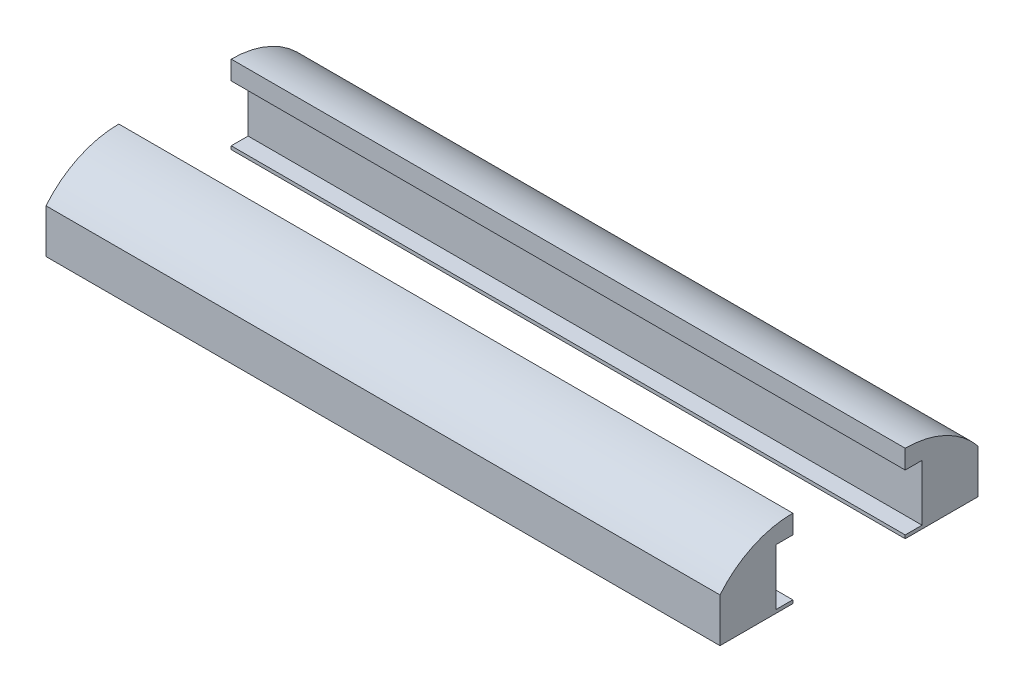
ISO-10303-21;
HEADER;
FILE_DESCRIPTION(('STEP AP214'),'2;1');
FILE_NAME('part.step','',(''),(''),'','','');
FILE_SCHEMA(('AUTOMOTIVE_DESIGN { 1 0 10303 214 1 1 1 1 }'));
ENDSEC;
DATA;
#1=APPLICATION_CONTEXT('core data for automotive mechanical design processes');
#2=APPLICATION_PROTOCOL_DEFINITION('international standard','automotive_design',2000,#1);
#3=PRODUCT_CONTEXT('',#1,'mechanical');
#4=PRODUCT('Part','Part','',(#3));
#5=PRODUCT_RELATED_PRODUCT_CATEGORY('part','',(#4));
#6=PRODUCT_DEFINITION_FORMATION('','',#4);
#7=PRODUCT_DEFINITION_CONTEXT('part definition',#1,'design');
#8=PRODUCT_DEFINITION('design','',#6,#7);
#9=PRODUCT_DEFINITION_SHAPE('','',#8);
#10=(LENGTH_UNIT() NAMED_UNIT(*) SI_UNIT(.MILLI.,.METRE.));
#11=(NAMED_UNIT(*) PLANE_ANGLE_UNIT() SI_UNIT($,.RADIAN.));
#12=(NAMED_UNIT(*) SI_UNIT($,.STERADIAN.) SOLID_ANGLE_UNIT());
#13=UNCERTAINTY_MEASURE_WITH_UNIT(LENGTH_MEASURE(1.E-05),#10,'distance_accuracy_value','');
#14=(GEOMETRIC_REPRESENTATION_CONTEXT(3) GLOBAL_UNCERTAINTY_ASSIGNED_CONTEXT((#13)) GLOBAL_UNIT_ASSIGNED_CONTEXT((#10,
#11,#12)) REPRESENTATION_CONTEXT('',''));
#15=CARTESIAN_POINT('',(0.,0.,0.));
#16=DIRECTION('',(0.,0.,1.));
#17=DIRECTION('',(1.,0.,0.));
#18=AXIS2_PLACEMENT_3D('',#15,#16,#17);
#19=CARTESIAN_POINT('',(120.,10.5947602395424,13.0083445093653));
#20=DIRECTION('',(0.,1.,0.));
#21=DIRECTION('',(0.,0.,1.));
#22=AXIS2_PLACEMENT_3D('',#19,#20,#21);
#23=PLANE('',#22);
#24=DIRECTION('',(0.,0.,-1.));
#25=VECTOR('',#24,1.);
#26=CARTESIAN_POINT('',(0.,10.5947602395424,13.0083445093653));
#27=LINE('',#26,#25);
#28=CARTESIAN_POINT('',(0.,10.5947602395424,13.0083445093653));
#29=VERTEX_POINT('',#28);
#30=CARTESIAN_POINT('',(0.,10.5947602395424,10.0083445093653));
#31=VERTEX_POINT('',#30);
#32=EDGE_CURVE('E12',#29,#31,#27,.T.);
#33=ORIENTED_EDGE('',*,*,#32,.T.);
#34=DIRECTION('',(-1.,0.,0.));
#35=VECTOR('',#34,1.);
#36=CARTESIAN_POINT('',(120.,10.5947602395424,10.0083445093653));
#37=LINE('',#36,#35);
#38=CARTESIAN_POINT('',(120.,10.5947602395424,10.0083445093653));
#39=VERTEX_POINT('',#38);
#40=EDGE_CURVE('E185',#39,#31,#37,.T.);
#41=ORIENTED_EDGE('',*,*,#40,.F.);
#42=DIRECTION('',(0.,0.,-1.));
#43=VECTOR('',#42,1.);
#44=CARTESIAN_POINT('',(120.,10.5947602395424,13.0083445093653));
#45=LINE('',#44,#43);
#46=CARTESIAN_POINT('',(120.,10.5947602395424,13.0083445093653));
#47=VERTEX_POINT('',#46);
#48=EDGE_CURVE('E53',#47,#39,#45,.T.);
#49=ORIENTED_EDGE('',*,*,#48,.F.);
#50=DIRECTION('',(-1.,0.,0.));
#51=VECTOR('',#50,1.);
#52=CARTESIAN_POINT('',(120.,10.5947602395424,13.0083445093653));
#53=LINE('',#52,#51);
#54=EDGE_CURVE('E153',#47,#29,#53,.T.);
#55=ORIENTED_EDGE('',*,*,#54,.T.);
#56=EDGE_LOOP('',(#33,#41,#49,#55));
#57=FACE_BOUND('',#56,.T.);
#58=ADVANCED_FACE('F49',(#57),#23,.F.);
#59=CARTESIAN_POINT('',(120.,10.5947602395424,10.0083445093653));
#60=DIRECTION('',(0.,0.,1.));
#61=DIRECTION('',(1.,0.,0.));
#62=AXIS2_PLACEMENT_3D('',#59,#60,#61);
#63=PLANE('',#62);
#64=DIRECTION('',(0.,1.,0.));
#65=VECTOR('',#64,1.);
#66=CARTESIAN_POINT('',(0.,10.5947602395424,10.0083445093653));
#67=LINE('',#66,#65);
#68=CARTESIAN_POINT('',(0.,13.96,10.0083445093653));
#69=VERTEX_POINT('',#68);
#70=EDGE_CURVE('E59',#31,#69,#67,.T.);
#71=ORIENTED_EDGE('',*,*,#70,.T.);
#72=DIRECTION('',(-1.,0.,0.));
#73=VECTOR('',#72,1.);
#74=CARTESIAN_POINT('',(120.,13.96,10.0083445093653));
#75=LINE('',#74,#73);
#76=CARTESIAN_POINT('',(120.,13.96,10.0083445093653));
#77=VERTEX_POINT('',#76);
#78=EDGE_CURVE('E129',#77,#69,#75,.T.);
#79=ORIENTED_EDGE('',*,*,#78,.F.);
#80=DIRECTION('',(0.,1.,0.));
#81=VECTOR('',#80,1.);
#82=CARTESIAN_POINT('',(120.,10.5947602395424,10.0083445093653));
#83=LINE('',#82,#81);
#84=EDGE_CURVE('E95',#39,#77,#83,.T.);
#85=ORIENTED_EDGE('',*,*,#84,.F.);
#86=ORIENTED_EDGE('',*,*,#40,.T.);
#87=EDGE_LOOP('',(#71,#79,#85,#86));
#88=FACE_BOUND('',#87,.T.);
#89=ADVANCED_FACE('F191',(#88),#63,.F.);
#90=CARTESIAN_POINT('',(120.,-2.8049673735726,10.0083445093653));
#91=DIRECTION('',(-1.,0.,0.));
#92=DIRECTION('',(0.,0.,1.));
#93=AXIS2_PLACEMENT_3D('',#90,#91,#92);
#94=CYLINDRICAL_SURFACE('',#93,16.7649673735726);
#95=CARTESIAN_POINT('',(0.,-2.8049673735726,10.0083445093653));
#96=DIRECTION('',(1.,0.,0.));
#97=DIRECTION('',(0.,0.,-1.));
#98=AXIS2_PLACEMENT_3D('',#95,#96,#97);
#99=CIRCLE('',#98,16.7649673735726);
#100=CARTESIAN_POINT('',(0.,7.83,22.9683445093653));
#101=VERTEX_POINT('',#100);
#102=EDGE_CURVE('E123',#69,#101,#99,.T.);
#103=ORIENTED_EDGE('',*,*,#102,.T.);
#104=DIRECTION('',(-1.,0.,0.));
#105=VECTOR('',#104,1.);
#106=CARTESIAN_POINT('',(120.,7.83,22.9683445093653));
#107=LINE('',#106,#105);
#108=CARTESIAN_POINT('',(120.,7.83,22.9683445093653));
#109=VERTEX_POINT('',#108);
#110=EDGE_CURVE('E127',#109,#101,#107,.T.);
#111=ORIENTED_EDGE('',*,*,#110,.F.);
#112=CARTESIAN_POINT('',(120.,-2.8049673735726,10.0083445093653));
#113=DIRECTION('',(1.,0.,0.));
#114=DIRECTION('',(0.,0.,-1.));
#115=AXIS2_PLACEMENT_3D('',#112,#113,#114);
#116=CIRCLE('',#115,16.7649673735726);
#117=EDGE_CURVE('E160',#77,#109,#116,.T.);
#118=ORIENTED_EDGE('',*,*,#117,.F.);
#119=ORIENTED_EDGE('',*,*,#78,.T.);
#120=EDGE_LOOP('',(#103,#111,#118,#119));
#121=FACE_BOUND('',#120,.T.);
#122=ADVANCED_FACE('F125',(#121),#94,.T.);
#123=CARTESIAN_POINT('',(120.,0.,22.9683445093653));
#124=DIRECTION('',(0.,0.,-1.));
#125=DIRECTION('',(0.,1.,0.));
#126=AXIS2_PLACEMENT_3D('',#123,#124,#125);
#127=PLANE('',#126);
#128=DIRECTION('',(0.,-1.,0.));
#129=VECTOR('',#128,1.);
#130=CARTESIAN_POINT('',(0.,0.,22.9683445093653));
#131=LINE('',#130,#129);
#132=CARTESIAN_POINT('',(0.,0.,22.9683445093653));
#133=VERTEX_POINT('',#132);
#134=EDGE_CURVE('E131',#101,#133,#131,.T.);
#135=ORIENTED_EDGE('',*,*,#134,.T.);
#136=DIRECTION('',(-1.,0.,0.));
#137=VECTOR('',#136,1.);
#138=CARTESIAN_POINT('',(120.,0.,22.9683445093653));
#139=LINE('',#138,#137);
#140=CARTESIAN_POINT('',(120.,0.,22.9683445093653));
#141=VERTEX_POINT('',#140);
#142=EDGE_CURVE('E138',#141,#133,#139,.T.);
#143=ORIENTED_EDGE('',*,*,#142,.F.);
#144=DIRECTION('',(0.,-1.,0.));
#145=VECTOR('',#144,1.);
#146=CARTESIAN_POINT('',(120.,0.,22.9683445093653));
#147=LINE('',#146,#145);
#148=EDGE_CURVE('E137',#109,#141,#147,.T.);
#149=ORIENTED_EDGE('',*,*,#148,.F.);
#150=ORIENTED_EDGE('',*,*,#110,.T.);
#151=EDGE_LOOP('',(#135,#143,#149,#150));
#152=FACE_BOUND('',#151,.T.);
#153=ADVANCED_FACE('F134',(#152),#127,.F.);
#154=CARTESIAN_POINT('',(120.,0.,10.0083445093653));
#155=DIRECTION('',(0.,1.,0.));
#156=DIRECTION('',(0.,0.,1.));
#157=AXIS2_PLACEMENT_3D('',#154,#155,#156);
#158=PLANE('',#157);
#159=DIRECTION('',(0.,0.,-1.));
#160=VECTOR('',#159,1.);
#161=CARTESIAN_POINT('',(0.,0.,10.0083445093653));
#162=LINE('',#161,#160);
#163=CARTESIAN_POINT('',(0.,0.,10.0083445093653));
#164=VERTEX_POINT('',#163);
#165=EDGE_CURVE('E143',#133,#164,#162,.T.);
#166=ORIENTED_EDGE('',*,*,#165,.T.);
#167=DIRECTION('',(-1.,0.,0.));
#168=VECTOR('',#167,1.);
#169=CARTESIAN_POINT('',(120.,0.,10.0083445093653));
#170=LINE('',#169,#168);
#171=CARTESIAN_POINT('',(120.,0.,10.0083445093653));
#172=VERTEX_POINT('',#171);
#173=EDGE_CURVE('E177',#172,#164,#170,.T.);
#174=ORIENTED_EDGE('',*,*,#173,.F.);
#175=DIRECTION('',(0.,0.,-1.));
#176=VECTOR('',#175,1.);
#177=CARTESIAN_POINT('',(120.,0.,10.0083445093653));
#178=LINE('',#177,#176);
#179=EDGE_CURVE('E157',#141,#172,#178,.T.);
#180=ORIENTED_EDGE('',*,*,#179,.F.);
#181=ORIENTED_EDGE('',*,*,#142,.T.);
#182=EDGE_LOOP('',(#166,#174,#180,#181));
#183=FACE_BOUND('',#182,.T.);
#184=ADVANCED_FACE('F194',(#183),#158,.F.);
#185=CARTESIAN_POINT('',(120.,0.,10.0083445093653));
#186=DIRECTION('',(0.,0.,1.));
#187=DIRECTION('',(1.,0.,0.));
#188=AXIS2_PLACEMENT_3D('',#185,#186,#187);
#189=PLANE('',#188);
#190=DIRECTION('',(0.,1.,0.));
#191=VECTOR('',#190,1.);
#192=CARTESIAN_POINT('',(0.,0.,10.0083445093653));
#193=LINE('',#192,#191);
#194=CARTESIAN_POINT('',(0.,0.594760239542357,10.0083445093653));
#195=VERTEX_POINT('',#194);
#196=EDGE_CURVE('E145',#164,#195,#193,.T.);
#197=ORIENTED_EDGE('',*,*,#196,.T.);
#198=DIRECTION('',(-1.,0.,0.));
#199=VECTOR('',#198,1.);
#200=CARTESIAN_POINT('',(120.,0.594760239542357,10.0083445093653));
#201=LINE('',#200,#199);
#202=CARTESIAN_POINT('',(120.,0.594760239542357,10.0083445093653));
#203=VERTEX_POINT('',#202);
#204=EDGE_CURVE('E174',#203,#195,#201,.T.);
#205=ORIENTED_EDGE('',*,*,#204,.F.);
#206=DIRECTION('',(0.,1.,0.));
#207=VECTOR('',#206,1.);
#208=CARTESIAN_POINT('',(120.,0.,10.0083445093653));
#209=LINE('',#208,#207);
#210=EDGE_CURVE('E155',#172,#203,#209,.T.);
#211=ORIENTED_EDGE('',*,*,#210,.F.);
#212=ORIENTED_EDGE('',*,*,#173,.T.);
#213=EDGE_LOOP('',(#197,#205,#211,#212));
#214=FACE_BOUND('',#213,.T.);
#215=ADVANCED_FACE('F172',(#214),#189,.F.);
#216=CARTESIAN_POINT('',(120.,0.594760239542357,10.0083445093653));
#217=DIRECTION('',(0.,-1.,0.));
#218=DIRECTION('',(0.,0.,-1.));
#219=AXIS2_PLACEMENT_3D('',#216,#217,#218);
#220=PLANE('',#219);
#221=DIRECTION('',(0.,0.,1.));
#222=VECTOR('',#221,1.);
#223=CARTESIAN_POINT('',(0.,0.594760239542357,10.0083445093653));
#224=LINE('',#223,#222);
#225=CARTESIAN_POINT('',(0.,0.594760239542357,13.0083445093653));
#226=VERTEX_POINT('',#225);
#227=EDGE_CURVE('E163',#195,#226,#224,.T.);
#228=ORIENTED_EDGE('',*,*,#227,.T.);
#229=DIRECTION('',(-1.,0.,0.));
#230=VECTOR('',#229,1.);
#231=CARTESIAN_POINT('',(120.,0.594760239542357,13.0083445093653));
#232=LINE('',#231,#230);
#233=CARTESIAN_POINT('',(120.,0.594760239542357,13.0083445093653));
#234=VERTEX_POINT('',#233);
#235=EDGE_CURVE('E182',#234,#226,#232,.T.);
#236=ORIENTED_EDGE('',*,*,#235,.F.);
#237=DIRECTION('',(0.,0.,1.));
#238=VECTOR('',#237,1.);
#239=CARTESIAN_POINT('',(120.,0.594760239542357,10.0083445093653));
#240=LINE('',#239,#238);
#241=EDGE_CURVE('E152',#203,#234,#240,.T.);
#242=ORIENTED_EDGE('',*,*,#241,.F.);
#243=ORIENTED_EDGE('',*,*,#204,.T.);
#244=EDGE_LOOP('',(#228,#236,#242,#243));
#245=FACE_BOUND('',#244,.T.);
#246=ADVANCED_FACE('F180',(#245),#220,.F.);
#247=CARTESIAN_POINT('',(120.,0.594760239542357,13.0083445093653));
#248=DIRECTION('',(0.,0.,1.));
#249=DIRECTION('',(1.,0.,0.));
#250=AXIS2_PLACEMENT_3D('',#247,#248,#249);
#251=PLANE('',#250);
#252=DIRECTION('',(0.,1.,0.));
#253=VECTOR('',#252,1.);
#254=CARTESIAN_POINT('',(0.,0.594760239542357,13.0083445093653));
#255=LINE('',#254,#253);
#256=EDGE_CURVE('E106',#226,#29,#255,.T.);
#257=ORIENTED_EDGE('',*,*,#256,.T.);
#258=ORIENTED_EDGE('',*,*,#54,.F.);
#259=DIRECTION('',(0.,1.,0.));
#260=VECTOR('',#259,1.);
#261=CARTESIAN_POINT('',(120.,0.594760239542357,13.0083445093653));
#262=LINE('',#261,#260);
#263=EDGE_CURVE('E150',#234,#47,#262,.T.);
#264=ORIENTED_EDGE('',*,*,#263,.F.);
#265=ORIENTED_EDGE('',*,*,#235,.T.);
#266=EDGE_LOOP('',(#257,#258,#264,#265));
#267=FACE_BOUND('',#266,.T.);
#268=ADVANCED_FACE('F195',(#267),#251,.F.);
#269=CARTESIAN_POINT('',(120.,-2.8049673735726,10.0083445093653));
#270=DIRECTION('',(1.,0.,0.));
#271=DIRECTION('',(0.,0.,-1.));
#272=AXIS2_PLACEMENT_3D('',#269,#270,#271);
#273=PLANE('',#272);
#274=ORIENTED_EDGE('',*,*,#48,.T.);
#275=ORIENTED_EDGE('',*,*,#84,.T.);
#276=ORIENTED_EDGE('',*,*,#117,.T.);
#277=ORIENTED_EDGE('',*,*,#148,.T.);
#278=ORIENTED_EDGE('',*,*,#179,.T.);
#279=ORIENTED_EDGE('',*,*,#210,.T.);
#280=ORIENTED_EDGE('',*,*,#241,.T.);
#281=ORIENTED_EDGE('',*,*,#263,.T.);
#282=EDGE_LOOP('',(#274,#275,#276,#277,#278,#279,#280,#281));
#283=FACE_BOUND('',#282,.T.);
#284=ADVANCED_FACE('F51',(#283),#273,.T.);
#285=CARTESIAN_POINT('',(0.,-2.8049673735726,10.0083445093653));
#286=DIRECTION('',(1.,0.,0.));
#287=DIRECTION('',(0.,0.,-1.));
#288=AXIS2_PLACEMENT_3D('',#285,#286,#287);
#289=PLANE('',#288);
#290=ORIENTED_EDGE('',*,*,#32,.F.);
#291=ORIENTED_EDGE('',*,*,#256,.F.);
#292=ORIENTED_EDGE('',*,*,#227,.F.);
#293=ORIENTED_EDGE('',*,*,#196,.F.);
#294=ORIENTED_EDGE('',*,*,#165,.F.);
#295=ORIENTED_EDGE('',*,*,#134,.F.);
#296=ORIENTED_EDGE('',*,*,#102,.F.);
#297=ORIENTED_EDGE('',*,*,#70,.F.);
#298=EDGE_LOOP('',(#290,#291,#292,#293,#294,#295,#296,#297));
#299=FACE_BOUND('',#298,.T.);
#300=ADVANCED_FACE('F141',(#299),#289,.F.);
#301=CLOSED_SHELL('',(#58,#89,#122,#153,#184,#215,#246,#268,#284,#300));
#302=MANIFOLD_SOLID_BREP('B2',#301);
#303=CARTESIAN_POINT('',(120.,0.,-10.0083445093653));
#304=DIRECTION('',(0.,0.,-1.));
#305=DIRECTION('',(-1.,0.,0.));
#306=AXIS2_PLACEMENT_3D('',#303,#304,#305);
#307=PLANE('',#306);
#308=DIRECTION('',(0.,-1.,0.));
#309=VECTOR('',#308,1.);
#310=CARTESIAN_POINT('',(0.,0.,-10.0083445093653));
#311=LINE('',#310,#309);
#312=CARTESIAN_POINT('',(0.,0.594760239542357,-10.0083445093653));
#313=VERTEX_POINT('',#312);
#314=CARTESIAN_POINT('',(0.,0.,-10.0083445093653));
#315=VERTEX_POINT('',#314);
#316=EDGE_CURVE('E373',#313,#315,#311,.T.);
#317=ORIENTED_EDGE('',*,*,#316,.T.);
#318=DIRECTION('',(-1.,0.,0.));
#319=VECTOR('',#318,1.);
#320=CARTESIAN_POINT('',(120.,0.,-10.0083445093653));
#321=LINE('',#320,#319);
#322=CARTESIAN_POINT('',(120.,0.,-10.0083445093653));
#323=VERTEX_POINT('',#322);
#324=EDGE_CURVE('E47',#323,#315,#321,.T.);
#325=ORIENTED_EDGE('',*,*,#324,.F.);
#326=DIRECTION('',(0.,-1.,0.));
#327=VECTOR('',#326,1.);
#328=CARTESIAN_POINT('',(120.,0.,-10.0083445093653));
#329=LINE('',#328,#327);
#330=CARTESIAN_POINT('',(120.,0.594760239542357,-10.0083445093653));
#331=VERTEX_POINT('',#330);
#332=EDGE_CURVE('E387',#331,#323,#329,.T.);
#333=ORIENTED_EDGE('',*,*,#332,.F.);
#334=DIRECTION('',(-1.,0.,0.));
#335=VECTOR('',#334,1.);
#336=CARTESIAN_POINT('',(120.,0.594760239542357,-10.0083445093653));
#337=LINE('',#336,#335);
#338=EDGE_CURVE('E369',#331,#313,#337,.T.);
#339=ORIENTED_EDGE('',*,*,#338,.T.);
#340=EDGE_LOOP('',(#317,#325,#333,#339));
#341=FACE_BOUND('',#340,.T.);
#342=ADVANCED_FACE('F277',(#341),#307,.F.);
#343=CARTESIAN_POINT('',(120.,0.,-10.0083445093653));
#344=DIRECTION('',(0.,1.,0.));
#345=DIRECTION('',(0.,0.,1.));
#346=AXIS2_PLACEMENT_3D('',#343,#344,#345);
#347=PLANE('',#346);
#348=DIRECTION('',(0.,0.,-1.));
#349=VECTOR('',#348,1.);
#350=CARTESIAN_POINT('',(0.,0.,-10.0083445093653));
#351=LINE('',#350,#349);
#352=CARTESIAN_POINT('',(0.,0.,-22.9683445093653));
#353=VERTEX_POINT('',#352);
#354=EDGE_CURVE('E376',#315,#353,#351,.T.);
#355=ORIENTED_EDGE('',*,*,#354,.T.);
#356=DIRECTION('',(-1.,0.,0.));
#357=VECTOR('',#356,1.);
#358=CARTESIAN_POINT('',(120.,0.,-22.9683445093653));
#359=LINE('',#358,#357);
#360=CARTESIAN_POINT('',(120.,0.,-22.9683445093653));
#361=VERTEX_POINT('',#360);
#362=EDGE_CURVE('E285',#361,#353,#359,.T.);
#363=ORIENTED_EDGE('',*,*,#362,.F.);
#364=DIRECTION('',(0.,0.,-1.));
#365=VECTOR('',#364,1.);
#366=CARTESIAN_POINT('',(120.,0.,-10.0083445093653));
#367=LINE('',#366,#365);
#368=EDGE_CURVE('E336',#323,#361,#367,.T.);
#369=ORIENTED_EDGE('',*,*,#368,.F.);
#370=ORIENTED_EDGE('',*,*,#324,.T.);
#371=EDGE_LOOP('',(#355,#363,#369,#370));
#372=FACE_BOUND('',#371,.T.);
#373=ADVANCED_FACE('F422',(#372),#347,.F.);
#374=CARTESIAN_POINT('',(120.,0.,-22.9683445093653));
#375=DIRECTION('',(0.,0.,1.));
#376=DIRECTION('',(0.,-1.,0.));
#377=AXIS2_PLACEMENT_3D('',#374,#375,#376);
#378=PLANE('',#377);
#379=DIRECTION('',(0.,1.,0.));
#380=VECTOR('',#379,1.);
#381=CARTESIAN_POINT('',(0.,0.,-22.9683445093653));
#382=LINE('',#381,#380);
#383=CARTESIAN_POINT('',(0.,7.83,-22.9683445093653));
#384=VERTEX_POINT('',#383);
#385=EDGE_CURVE('E378',#353,#384,#382,.T.);
#386=ORIENTED_EDGE('',*,*,#385,.T.);
#387=DIRECTION('',(-1.,0.,0.));
#388=VECTOR('',#387,1.);
#389=CARTESIAN_POINT('',(120.,7.83,-22.9683445093653));
#390=LINE('',#389,#388);
#391=CARTESIAN_POINT('',(120.,7.83,-22.9683445093653));
#392=VERTEX_POINT('',#391);
#393=EDGE_CURVE('E394',#392,#384,#390,.T.);
#394=ORIENTED_EDGE('',*,*,#393,.F.);
#395=DIRECTION('',(0.,1.,0.));
#396=VECTOR('',#395,1.);
#397=CARTESIAN_POINT('',(120.,0.,-22.9683445093653));
#398=LINE('',#397,#396);
#399=EDGE_CURVE('E402',#361,#392,#398,.T.);
#400=ORIENTED_EDGE('',*,*,#399,.F.);
#401=ORIENTED_EDGE('',*,*,#362,.T.);
#402=EDGE_LOOP('',(#386,#394,#400,#401));
#403=FACE_BOUND('',#402,.T.);
#404=ADVANCED_FACE('F400',(#403),#378,.F.);
#405=CARTESIAN_POINT('',(120.,-2.8049673735726,-10.0083445093653));
#406=DIRECTION('',(-1.,0.,0.));
#407=DIRECTION('',(0.,0.,1.));
#408=AXIS2_PLACEMENT_3D('',#405,#406,#407);
#409=CYLINDRICAL_SURFACE('',#408,16.7649673735726);
#410=CARTESIAN_POINT('',(0.,-2.8049673735726,-10.0083445093653));
#411=DIRECTION('',(1.,0.,0.));
#412=DIRECTION('',(0.,0.,1.));
#413=AXIS2_PLACEMENT_3D('',#410,#411,#412);
#414=CIRCLE('',#413,16.7649673735726);
#415=CARTESIAN_POINT('',(0.,13.96,-10.0083445093653));
#416=VERTEX_POINT('',#415);
#417=EDGE_CURVE('E380',#384,#416,#414,.T.);
#418=ORIENTED_EDGE('',*,*,#417,.T.);
#419=DIRECTION('',(-1.,0.,0.));
#420=VECTOR('',#419,1.);
#421=CARTESIAN_POINT('',(120.,13.96,-10.0083445093653));
#422=LINE('',#421,#420);
#423=CARTESIAN_POINT('',(120.,13.96,-10.0083445093653));
#424=VERTEX_POINT('',#423);
#425=EDGE_CURVE('E391',#424,#416,#422,.T.);
#426=ORIENTED_EDGE('',*,*,#425,.F.);
#427=CARTESIAN_POINT('',(120.,-2.8049673735726,-10.0083445093653));
#428=DIRECTION('',(1.,0.,0.));
#429=DIRECTION('',(0.,0.,1.));
#430=AXIS2_PLACEMENT_3D('',#427,#428,#429);
#431=CIRCLE('',#430,16.7649673735726);
#432=EDGE_CURVE('E414',#392,#424,#431,.T.);
#433=ORIENTED_EDGE('',*,*,#432,.F.);
#434=ORIENTED_EDGE('',*,*,#393,.T.);
#435=EDGE_LOOP('',(#418,#426,#433,#434));
#436=FACE_BOUND('',#435,.T.);
#437=ADVANCED_FACE('F410',(#436),#409,.T.);
#438=CARTESIAN_POINT('',(120.,10.5947602395424,-10.0083445093653));
#439=DIRECTION('',(0.,0.,-1.));
#440=DIRECTION('',(-1.,0.,0.));
#441=AXIS2_PLACEMENT_3D('',#438,#439,#440);
#442=PLANE('',#441);
#443=DIRECTION('',(0.,-1.,0.));
#444=VECTOR('',#443,1.);
#445=CARTESIAN_POINT('',(0.,10.5947602395424,-10.0083445093653));
#446=LINE('',#445,#444);
#447=CARTESIAN_POINT('',(0.,10.5947602395424,-10.0083445093653));
#448=VERTEX_POINT('',#447);
#449=EDGE_CURVE('E382',#416,#448,#446,.T.);
#450=ORIENTED_EDGE('',*,*,#449,.T.);
#451=DIRECTION('',(-1.,0.,0.));
#452=VECTOR('',#451,1.);
#453=CARTESIAN_POINT('',(120.,10.5947602395424,-10.0083445093653));
#454=LINE('',#453,#452);
#455=CARTESIAN_POINT('',(120.,10.5947602395424,-10.0083445093653));
#456=VERTEX_POINT('',#455);
#457=EDGE_CURVE('E364',#456,#448,#454,.T.);
#458=ORIENTED_EDGE('',*,*,#457,.F.);
#459=DIRECTION('',(0.,-1.,0.));
#460=VECTOR('',#459,1.);
#461=CARTESIAN_POINT('',(120.,10.5947602395424,-10.0083445093653));
#462=LINE('',#461,#460);
#463=EDGE_CURVE('E355',#424,#456,#462,.T.);
#464=ORIENTED_EDGE('',*,*,#463,.F.);
#465=ORIENTED_EDGE('',*,*,#425,.T.);
#466=EDGE_LOOP('',(#450,#458,#464,#465));
#467=FACE_BOUND('',#466,.T.);
#468=ADVANCED_FACE('F413',(#467),#442,.F.);
#469=CARTESIAN_POINT('',(120.,10.5947602395424,-13.0083445093653));
#470=DIRECTION('',(0.,1.,0.));
#471=DIRECTION('',(0.,0.,1.));
#472=AXIS2_PLACEMENT_3D('',#469,#470,#471);
#473=PLANE('',#472);
#474=DIRECTION('',(0.,0.,-1.));
#475=VECTOR('',#474,1.);
#476=CARTESIAN_POINT('',(0.,10.5947602395424,-13.0083445093653));
#477=LINE('',#476,#475);
#478=CARTESIAN_POINT('',(0.,10.5947602395424,-13.0083445093653));
#479=VERTEX_POINT('',#478);
#480=EDGE_CURVE('E363',#448,#479,#477,.T.);
#481=ORIENTED_EDGE('',*,*,#480,.T.);
#482=DIRECTION('',(-1.,0.,0.));
#483=VECTOR('',#482,1.);
#484=CARTESIAN_POINT('',(120.,10.5947602395424,-13.0083445093653));
#485=LINE('',#484,#483);
#486=CARTESIAN_POINT('',(120.,10.5947602395424,-13.0083445093653));
#487=VERTEX_POINT('',#486);
#488=EDGE_CURVE('E360',#487,#479,#485,.T.);
#489=ORIENTED_EDGE('',*,*,#488,.F.);
#490=DIRECTION('',(0.,0.,-1.));
#491=VECTOR('',#490,1.);
#492=CARTESIAN_POINT('',(120.,10.5947602395424,-13.0083445093653));
#493=LINE('',#492,#491);
#494=EDGE_CURVE('E349',#456,#487,#493,.T.);
#495=ORIENTED_EDGE('',*,*,#494,.F.);
#496=ORIENTED_EDGE('',*,*,#457,.T.);
#497=EDGE_LOOP('',(#481,#489,#495,#496));
#498=FACE_BOUND('',#497,.T.);
#499=ADVANCED_FACE('F361',(#498),#473,.F.);
#500=CARTESIAN_POINT('',(120.,0.594760239542357,-13.0083445093653));
#501=DIRECTION('',(0.,0.,-1.));
#502=DIRECTION('',(-1.,0.,0.));
#503=AXIS2_PLACEMENT_3D('',#500,#501,#502);
#504=PLANE('',#503);
#505=DIRECTION('',(0.,-1.,0.));
#506=VECTOR('',#505,1.);
#507=CARTESIAN_POINT('',(0.,0.594760239542357,-13.0083445093653));
#508=LINE('',#507,#506);
#509=CARTESIAN_POINT('',(0.,0.594760239542357,-13.0083445093653));
#510=VERTEX_POINT('',#509);
#511=EDGE_CURVE('E322',#479,#510,#508,.T.);
#512=ORIENTED_EDGE('',*,*,#511,.T.);
#513=DIRECTION('',(-1.,0.,0.));
#514=VECTOR('',#513,1.);
#515=CARTESIAN_POINT('',(120.,0.594760239542357,-13.0083445093653));
#516=LINE('',#515,#514);
#517=CARTESIAN_POINT('',(120.,0.594760239542357,-13.0083445093653));
#518=VERTEX_POINT('',#517);
#519=EDGE_CURVE('E365',#518,#510,#516,.T.);
#520=ORIENTED_EDGE('',*,*,#519,.F.);
#521=DIRECTION('',(0.,-1.,0.));
#522=VECTOR('',#521,1.);
#523=CARTESIAN_POINT('',(120.,0.594760239542357,-13.0083445093653));
#524=LINE('',#523,#522);
#525=EDGE_CURVE('E353',#487,#518,#524,.T.);
#526=ORIENTED_EDGE('',*,*,#525,.F.);
#527=ORIENTED_EDGE('',*,*,#488,.T.);
#528=EDGE_LOOP('',(#512,#520,#526,#527));
#529=FACE_BOUND('',#528,.T.);
#530=ADVANCED_FACE('F367',(#529),#504,.F.);
#531=CARTESIAN_POINT('',(120.,0.594760239542357,-10.0083445093653));
#532=DIRECTION('',(0.,-1.,0.));
#533=DIRECTION('',(0.,0.,-1.));
#534=AXIS2_PLACEMENT_3D('',#531,#532,#533);
#535=PLANE('',#534);
#536=DIRECTION('',(0.,0.,1.));
#537=VECTOR('',#536,1.);
#538=CARTESIAN_POINT('',(0.,0.594760239542357,-10.0083445093653));
#539=LINE('',#538,#537);
#540=EDGE_CURVE('E328',#510,#313,#539,.T.);
#541=ORIENTED_EDGE('',*,*,#540,.T.);
#542=ORIENTED_EDGE('',*,*,#338,.F.);
#543=DIRECTION('',(0.,0.,1.));
#544=VECTOR('',#543,1.);
#545=CARTESIAN_POINT('',(120.,0.594760239542357,-10.0083445093653));
#546=LINE('',#545,#544);
#547=EDGE_CURVE('E293',#518,#331,#546,.T.);
#548=ORIENTED_EDGE('',*,*,#547,.F.);
#549=ORIENTED_EDGE('',*,*,#519,.T.);
#550=EDGE_LOOP('',(#541,#542,#548,#549));
#551=FACE_BOUND('',#550,.T.);
#552=ADVANCED_FACE('F438',(#551),#535,.F.);
#553=CARTESIAN_POINT('',(120.,-2.8049673735726,-10.0083445093653));
#554=DIRECTION('',(-1.,0.,0.));
#555=DIRECTION('',(0.,0.,1.));
#556=AXIS2_PLACEMENT_3D('',#553,#554,#555);
#557=PLANE('',#556);
#558=ORIENTED_EDGE('',*,*,#332,.T.);
#559=ORIENTED_EDGE('',*,*,#368,.T.);
#560=ORIENTED_EDGE('',*,*,#399,.T.);
#561=ORIENTED_EDGE('',*,*,#432,.T.);
#562=ORIENTED_EDGE('',*,*,#463,.T.);
#563=ORIENTED_EDGE('',*,*,#494,.T.);
#564=ORIENTED_EDGE('',*,*,#525,.T.);
#565=ORIENTED_EDGE('',*,*,#547,.T.);
#566=EDGE_LOOP('',(#558,#559,#560,#561,#562,#563,#564,#565));
#567=FACE_BOUND('',#566,.T.);
#568=ADVANCED_FACE('F351',(#567),#557,.F.);
#569=CARTESIAN_POINT('',(0.,-2.8049673735726,-10.0083445093653));
#570=DIRECTION('',(-1.,0.,0.));
#571=DIRECTION('',(0.,0.,1.));
#572=AXIS2_PLACEMENT_3D('',#569,#570,#571);
#573=PLANE('',#572);
#574=ORIENTED_EDGE('',*,*,#316,.F.);
#575=ORIENTED_EDGE('',*,*,#540,.F.);
#576=ORIENTED_EDGE('',*,*,#511,.F.);
#577=ORIENTED_EDGE('',*,*,#480,.F.);
#578=ORIENTED_EDGE('',*,*,#449,.F.);
#579=ORIENTED_EDGE('',*,*,#417,.F.);
#580=ORIENTED_EDGE('',*,*,#385,.F.);
#581=ORIENTED_EDGE('',*,*,#354,.F.);
#582=EDGE_LOOP('',(#574,#575,#576,#577,#578,#579,#580,#581));
#583=FACE_BOUND('',#582,.T.);
#584=ADVANCED_FACE('F406',(#583),#573,.T.);
#585=CLOSED_SHELL('',(#342,#373,#404,#437,#468,#499,#530,#552,#568,#584));
#586=MANIFOLD_SOLID_BREP('B6',#585);
#587=ADVANCED_BREP_SHAPE_REPRESENTATION('',(#18,#302,#586),#14);
#588=SHAPE_DEFINITION_REPRESENTATION(#9,#587);
ENDSEC;
END-ISO-10303-21;
